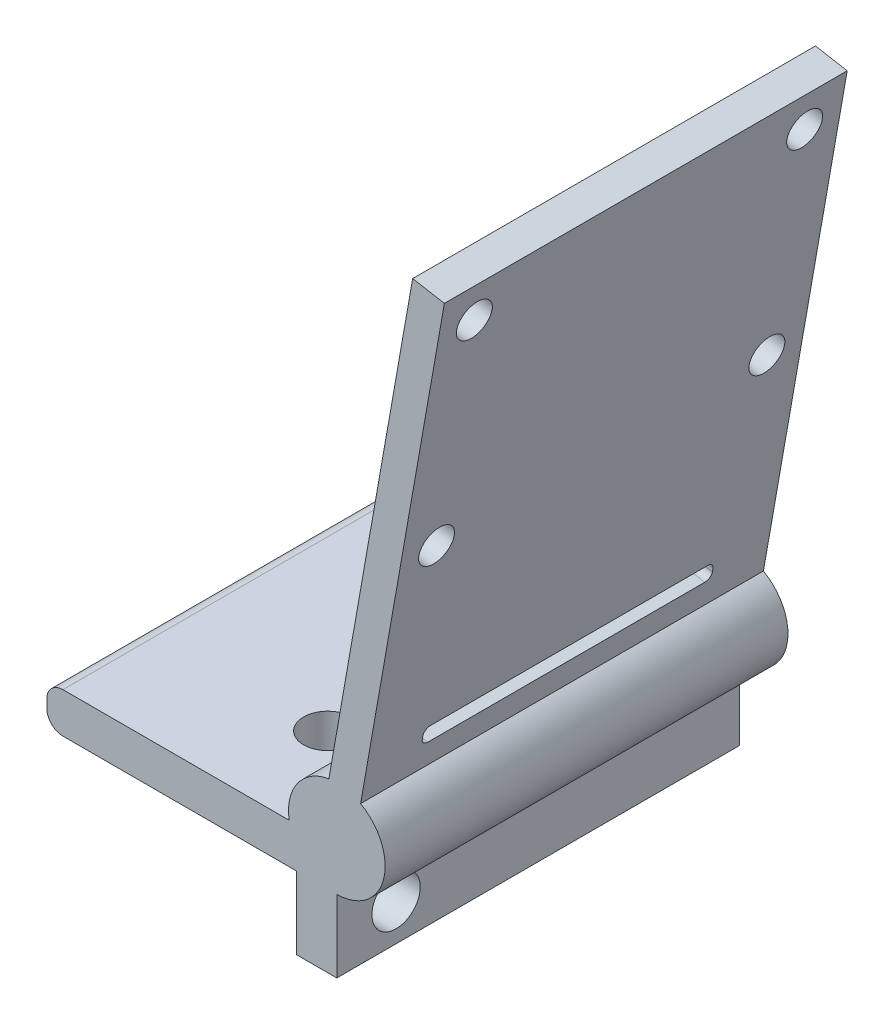
ISO-10303-21;
HEADER;
FILE_DESCRIPTION(('STEP AP214'),'2;1');
FILE_NAME('part.step','',(''),(''),'','','');
FILE_SCHEMA(('AUTOMOTIVE_DESIGN { 1 0 10303 214 1 1 1 1 }'));
ENDSEC;
DATA;
#1=APPLICATION_CONTEXT('core data for automotive mechanical design processes');
#2=APPLICATION_PROTOCOL_DEFINITION('international standard','automotive_design',2000,#1);
#3=PRODUCT_CONTEXT('',#1,'mechanical');
#4=PRODUCT('Part','Part','',(#3));
#5=PRODUCT_RELATED_PRODUCT_CATEGORY('part','',(#4));
#6=PRODUCT_DEFINITION_FORMATION('','',#4);
#7=PRODUCT_DEFINITION_CONTEXT('part definition',#1,'design');
#8=PRODUCT_DEFINITION('design','',#6,#7);
#9=PRODUCT_DEFINITION_SHAPE('','',#8);
#10=(LENGTH_UNIT() NAMED_UNIT(*) SI_UNIT(.MILLI.,.METRE.));
#11=(NAMED_UNIT(*) PLANE_ANGLE_UNIT() SI_UNIT($,.RADIAN.));
#12=(NAMED_UNIT(*) SI_UNIT($,.STERADIAN.) SOLID_ANGLE_UNIT());
#13=UNCERTAINTY_MEASURE_WITH_UNIT(LENGTH_MEASURE(1.E-05),#10,'distance_accuracy_value','');
#14=(GEOMETRIC_REPRESENTATION_CONTEXT(3) GLOBAL_UNCERTAINTY_ASSIGNED_CONTEXT((#13)) GLOBAL_UNIT_ASSIGNED_CONTEXT((#10,
#11,#12)) REPRESENTATION_CONTEXT('',''));
#15=CARTESIAN_POINT('',(0.,0.,0.));
#16=DIRECTION('',(0.,0.,1.));
#17=DIRECTION('',(1.,0.,0.));
#18=AXIS2_PLACEMENT_3D('',#15,#16,#17);
#19=CARTESIAN_POINT('',(-0.984807753012212,0.173648177666927,12.5));
#20=DIRECTION('',(0.984807753012209,-0.173648177666926,0.));
#21=DIRECTION('',(0.173648177666926,0.984807753012209,0.));
#22=AXIS2_PLACEMENT_3D('',#19,#20,#21);
#23=PLANE('',#22);
#24=CARTESIAN_POINT('',(4.31493462938239,30.2299807995996,-10.25));
#25=DIRECTION('',(0.984807753012209,-0.173648177666926,0.));
#26=DIRECTION('',(0.173648177666926,0.984807753012209,0.));
#27=AXIS2_PLACEMENT_3D('',#24,#25,#26);
#28=CIRCLE('',#27,1.1);
#29=CARTESIAN_POINT('',(4.50594762481601,31.313269327913,-10.25));
#30=VERTEX_POINT('',#29);
#31=EDGE_CURVE('E353',#30,#30,#28,.T.);
#32=ORIENTED_EDGE('',*,*,#31,.T.);
#33=EDGE_LOOP('',(#32));
#34=FACE_BOUND('',#33,.T.);
#35=CARTESIAN_POINT('',(1.97068423087889,16.9350761339348,-10.25));
#36=DIRECTION('',(0.984807753012209,-0.173648177666926,0.));
#37=DIRECTION('',(0.173648177666926,0.984807753012209,0.));
#38=AXIS2_PLACEMENT_3D('',#35,#36,#37);
#39=CIRCLE('',#38,1.1);
#40=CARTESIAN_POINT('',(2.16169722631251,18.0183646622482,-10.25));
#41=VERTEX_POINT('',#40);
#42=EDGE_CURVE('E359',#41,#41,#39,.T.);
#43=ORIENTED_EDGE('',*,*,#42,.T.);
#44=EDGE_LOOP('',(#43));
#45=FACE_BOUND('',#44,.T.);
#46=CARTESIAN_POINT('',(1.97068423087889,16.9350761339348,10.25));
#47=DIRECTION('',(0.984807753012209,-0.173648177666926,0.));
#48=DIRECTION('',(0.173648177666926,0.984807753012209,0.));
#49=AXIS2_PLACEMENT_3D('',#46,#47,#48);
#50=CIRCLE('',#49,1.1);
#51=CARTESIAN_POINT('',(2.16169722631251,18.0183646622482,10.25));
#52=VERTEX_POINT('',#51);
#53=EDGE_CURVE('E347',#52,#52,#50,.T.);
#54=ORIENTED_EDGE('',*,*,#53,.T.);
#55=EDGE_LOOP('',(#54));
#56=FACE_BOUND('',#55,.T.);
#57=CARTESIAN_POINT('',(4.31493462938239,30.2299807995996,10.25));
#58=DIRECTION('',(0.984807753012209,-0.173648177666926,0.));
#59=DIRECTION('',(0.173648177666926,0.984807753012209,0.));
#60=AXIS2_PLACEMENT_3D('',#57,#58,#59);
#61=CIRCLE('',#60,1.1);
#62=CARTESIAN_POINT('',(4.50594762481601,31.313269327913,10.25));
#63=VERTEX_POINT('',#62);
#64=EDGE_CURVE('E341',#63,#63,#61,.T.);
#65=ORIENTED_EDGE('',*,*,#64,.T.);
#66=EDGE_LOOP('',(#65));
#67=FACE_BOUND('',#66,.T.);
#68=DIRECTION('',(0.,0.,1.));
#69=VECTOR('',#68,1.);
#70=CARTESIAN_POINT('',(-0.0595360929690105,5.42112452147752,8.6));
#71=LINE('',#70,#69);
#72=CARTESIAN_POINT('',(-0.0595360929690105,5.42112452147752,-8.59999999999999));
#73=VERTEX_POINT('',#72);
#74=CARTESIAN_POINT('',(-0.0595360929690105,5.42112452147752,8.6));
#75=VERTEX_POINT('',#74);
#76=EDGE_CURVE('E254',#73,#75,#71,.T.);
#77=ORIENTED_EDGE('',*,*,#76,.T.);
#78=CARTESIAN_POINT('',(-0.128995364035781,5.02720142027264,8.6));
#79=DIRECTION('',(0.984807753012209,-0.173648177666926,0.));
#80=DIRECTION('',(0.173648177666926,0.984807753012209,0.));
#81=AXIS2_PLACEMENT_3D('',#78,#79,#80);
#82=CIRCLE('',#81,0.4);
#83=CARTESIAN_POINT('',(-0.128995364035782,5.02720142027264,9.));
#84=VERTEX_POINT('',#83);
#85=EDGE_CURVE('E268',#75,#84,#82,.T.);
#86=ORIENTED_EDGE('',*,*,#85,.T.);
#87=DIRECTION('',(-0.173648177666926,-0.984807753012209,0.));
#88=VECTOR('',#87,1.);
#89=CARTESIAN_POINT('',(-0.163724999569166,4.8302398696702,9.));
#90=LINE('',#89,#88);
#91=CARTESIAN_POINT('',(-0.163724999569166,4.83023986967024,9.));
#92=VERTEX_POINT('',#91);
#93=EDGE_CURVE('E305',#84,#92,#90,.T.);
#94=ORIENTED_EDGE('',*,*,#93,.T.);
#95=CARTESIAN_POINT('',(-0.163724999569166,4.8302398696702,8.6));
#96=DIRECTION('',(0.984807753012209,-0.173648177666926,0.));
#97=DIRECTION('',(-0.173648177666926,-0.984807753012209,0.));
#98=AXIS2_PLACEMENT_3D('',#95,#96,#97);
#99=CIRCLE('',#98,0.4);
#100=CARTESIAN_POINT('',(-0.233184270635937,4.43631676846532,8.6));
#101=VERTEX_POINT('',#100);
#102=EDGE_CURVE('E57',#92,#101,#99,.T.);
#103=ORIENTED_EDGE('',*,*,#102,.T.);
#104=DIRECTION('',(0.,0.,-1.));
#105=VECTOR('',#104,1.);
#106=CARTESIAN_POINT('',(-0.233184270635937,4.43631676846532,8.6));
#107=LINE('',#106,#105);
#108=CARTESIAN_POINT('',(-0.233184270635937,4.43631676846532,-8.6));
#109=VERTEX_POINT('',#108);
#110=EDGE_CURVE('E301',#101,#109,#107,.T.);
#111=ORIENTED_EDGE('',*,*,#110,.T.);
#112=CARTESIAN_POINT('',(-0.163724999569166,4.8302398696702,-8.6));
#113=DIRECTION('',(0.984807753012209,-0.173648177666926,0.));
#114=DIRECTION('',(-0.173648177666926,-0.984807753012209,0.));
#115=AXIS2_PLACEMENT_3D('',#112,#113,#114);
#116=CIRCLE('',#115,0.4);
#117=CARTESIAN_POINT('',(-0.163724999569166,4.8302398696702,-9.));
#118=VERTEX_POINT('',#117);
#119=EDGE_CURVE('E298',#109,#118,#116,.T.);
#120=ORIENTED_EDGE('',*,*,#119,.T.);
#121=DIRECTION('',(0.173648177666926,0.984807753012209,0.));
#122=VECTOR('',#121,1.);
#123=CARTESIAN_POINT('',(-0.163724999569166,4.8302398696702,-9.));
#124=LINE('',#123,#122);
#125=CARTESIAN_POINT('',(-0.128995364035781,5.02720142027264,-9.));
#126=VERTEX_POINT('',#125);
#127=EDGE_CURVE('E295',#118,#126,#124,.T.);
#128=ORIENTED_EDGE('',*,*,#127,.T.);
#129=CARTESIAN_POINT('',(-0.128995364035781,5.02720142027264,-8.6));
#130=DIRECTION('',(0.984807753012209,-0.173648177666926,0.));
#131=DIRECTION('',(-0.173648177666926,-0.984807753012209,0.));
#132=AXIS2_PLACEMENT_3D('',#129,#130,#131);
#133=CIRCLE('',#132,0.4);
#134=EDGE_CURVE('E292',#126,#73,#133,.T.);
#135=ORIENTED_EDGE('',*,*,#134,.T.);
#136=EDGE_LOOP('',(#77,#86,#94,#103,#111,#120,#128,#135));
#137=FACE_BOUND('',#136,.T.);
#138=DIRECTION('',(-0.173648177666926,-0.984807753012209,0.));
#139=VECTOR('',#138,1.);
#140=CARTESIAN_POINT('',(-0.984807753012212,0.173648177666927,-12.5));
#141=LINE('',#140,#139);
#142=CARTESIAN_POINT('',(4.70564302913297,32.445798243877,-12.5));
#143=VERTEX_POINT('',#142);
#144=CARTESIAN_POINT('',(-0.493656537136332,2.959105138947,-12.5));
#145=VERTEX_POINT('',#144);
#146=EDGE_CURVE('E214',#143,#145,#141,.T.);
#147=ORIENTED_EDGE('',*,*,#146,.T.);
#148=DIRECTION('',(0.,0.,-1.));
#149=VECTOR('',#148,1.);
#150=CARTESIAN_POINT('',(-0.493656537136332,2.959105138947,12.5));
#151=LINE('',#150,#149);
#152=CARTESIAN_POINT('',(-0.493656537136332,2.959105138947,12.5));
#153=VERTEX_POINT('',#152);
#154=EDGE_CURVE('E11',#153,#145,#151,.T.);
#155=ORIENTED_EDGE('',*,*,#154,.F.);
#156=DIRECTION('',(-0.173648177666926,-0.984807753012209,0.));
#157=VECTOR('',#156,1.);
#158=CARTESIAN_POINT('',(-0.984807753012212,0.173648177666927,12.5));
#159=LINE('',#158,#157);
#160=CARTESIAN_POINT('',(4.70564302913297,32.445798243877,12.5));
#161=VERTEX_POINT('',#160);
#162=EDGE_CURVE('E247',#161,#153,#159,.T.);
#163=ORIENTED_EDGE('',*,*,#162,.F.);
#164=DIRECTION('',(0.,0.,-1.));
#165=VECTOR('',#164,1.);
#166=CARTESIAN_POINT('',(4.70564302913297,32.445798243877,12.5));
#167=LINE('',#166,#165);
#168=EDGE_CURVE('E229',#161,#143,#167,.T.);
#169=ORIENTED_EDGE('',*,*,#168,.T.);
#170=EDGE_LOOP('',(#147,#155,#163,#169));
#171=FACE_BOUND('',#170,.T.);
#172=ADVANCED_FACE('F35',(#34,#45,#56,#67,#137,#171),#23,.F.);
#173=CARTESIAN_POINT('',(0.,0.,12.5));
#174=DIRECTION('',(0.,0.,-1.));
#175=DIRECTION('',(-1.,0.,0.));
#176=AXIS2_PLACEMENT_3D('',#173,#174,#175);
#177=CYLINDRICAL_SURFACE('',#176,3.);
#178=CARTESIAN_POINT('',(0.,0.,-12.5));
#179=DIRECTION('',(0.,0.,1.));
#180=DIRECTION('',(1.,0.,0.));
#181=AXIS2_PLACEMENT_3D('',#178,#179,#180);
#182=CIRCLE('',#181,3.);
#183=CARTESIAN_POINT('',(-2.95803989154981,-0.500000000000001,-12.5));
#184=VERTEX_POINT('',#183);
#185=EDGE_CURVE('E206',#145,#184,#182,.T.);
#186=ORIENTED_EDGE('',*,*,#185,.T.);
#187=DIRECTION('',(0.,0.,-1.));
#188=VECTOR('',#187,1.);
#189=CARTESIAN_POINT('',(-2.95803989154981,-0.500000000000001,12.5));
#190=LINE('',#189,#188);
#191=CARTESIAN_POINT('',(-2.95803989154981,-0.500000000000001,12.5));
#192=VERTEX_POINT('',#191);
#193=EDGE_CURVE('E42',#192,#184,#190,.T.);
#194=ORIENTED_EDGE('',*,*,#193,.F.);
#195=CARTESIAN_POINT('',(0.,0.,12.5));
#196=DIRECTION('',(0.,0.,1.));
#197=DIRECTION('',(1.,0.,0.));
#198=AXIS2_PLACEMENT_3D('',#195,#196,#197);
#199=CIRCLE('',#198,3.);
#200=EDGE_CURVE('E245',#153,#192,#199,.T.);
#201=ORIENTED_EDGE('',*,*,#200,.F.);
#202=ORIENTED_EDGE('',*,*,#154,.T.);
#203=EDGE_LOOP('',(#186,#194,#201,#202));
#204=FACE_BOUND('',#203,.T.);
#205=ADVANCED_FACE('F446',(#204),#177,.T.);
#206=CARTESIAN_POINT('',(0.,-0.5,12.5));
#207=DIRECTION('',(0.,-1.,0.));
#208=DIRECTION('',(1.,0.,0.));
#209=AXIS2_PLACEMENT_3D('',#206,#207,#208);
#210=PLANE('',#209);
#211=CARTESIAN_POINT('',(-6.56266980409438,-0.500000000000002,6.5));
#212=DIRECTION('',(0.,-1.,0.));
#213=DIRECTION('',(1.,0.,0.));
#214=AXIS2_PLACEMENT_3D('',#211,#212,#213);
#215=CIRCLE('',#214,1.5);
#216=CARTESIAN_POINT('',(-5.06266980409438,-0.500000000000001,6.5));
#217=VERTEX_POINT('',#216);
#218=EDGE_CURVE('E289',#217,#217,#215,.T.);
#219=ORIENTED_EDGE('',*,*,#218,.T.);
#220=EDGE_LOOP('',(#219));
#221=FACE_BOUND('',#220,.T.);
#222=CARTESIAN_POINT('',(-6.56266980409437,-0.500000000000002,-6.5));
#223=DIRECTION('',(0.,-1.,0.));
#224=DIRECTION('',(1.,0.,0.));
#225=AXIS2_PLACEMENT_3D('',#222,#223,#224);
#226=CIRCLE('',#225,1.5);
#227=CARTESIAN_POINT('',(-5.06266980409437,-0.500000000000001,-6.5));
#228=VERTEX_POINT('',#227);
#229=EDGE_CURVE('E313',#228,#228,#226,.T.);
#230=ORIENTED_EDGE('',*,*,#229,.T.);
#231=EDGE_LOOP('',(#230));
#232=FACE_BOUND('',#231,.T.);
#233=DIRECTION('',(-1.,0.,0.));
#234=VECTOR('',#233,1.);
#235=CARTESIAN_POINT('',(0.,-0.5,-12.5));
#236=LINE('',#235,#234);
#237=CARTESIAN_POINT('',(-17.,-0.500000000000003,-12.5));
#238=VERTEX_POINT('',#237);
#239=EDGE_CURVE('E213',#184,#238,#236,.T.);
#240=ORIENTED_EDGE('',*,*,#239,.T.);
#241=DIRECTION('',(0.,0.,-1.));
#242=VECTOR('',#241,1.);
#243=CARTESIAN_POINT('',(-17.,-0.500000000000003,12.5));
#244=LINE('',#243,#242);
#245=CARTESIAN_POINT('',(-17.,-0.500000000000003,12.5));
#246=VERTEX_POINT('',#245);
#247=EDGE_CURVE('E403',#246,#238,#244,.T.);
#248=ORIENTED_EDGE('',*,*,#247,.F.);
#249=DIRECTION('',(-1.,0.,0.));
#250=VECTOR('',#249,1.);
#251=CARTESIAN_POINT('',(0.,-0.5,12.5));
#252=LINE('',#251,#250);
#253=EDGE_CURVE('E243',#192,#246,#252,.T.);
#254=ORIENTED_EDGE('',*,*,#253,.F.);
#255=ORIENTED_EDGE('',*,*,#193,.T.);
#256=EDGE_LOOP('',(#240,#248,#254,#255));
#257=FACE_BOUND('',#256,.T.);
#258=ADVANCED_FACE('F408',(#221,#232,#257),#210,.F.);
#259=CARTESIAN_POINT('',(-17.,-1.5,12.5));
#260=DIRECTION('',(0.,0.,-1.));
#261=DIRECTION('',(-1.,0.,0.));
#262=AXIS2_PLACEMENT_3D('',#259,#260,#261);
#263=CYLINDRICAL_SURFACE('',#262,1.);
#264=CARTESIAN_POINT('',(-17.,-1.5,-12.5));
#265=DIRECTION('',(0.,0.,1.));
#266=DIRECTION('',(1.,0.,0.));
#267=AXIS2_PLACEMENT_3D('',#264,#265,#266);
#268=CIRCLE('',#267,1.);
#269=CARTESIAN_POINT('',(-18.,-1.50000000000001,-12.5));
#270=VERTEX_POINT('',#269);
#271=EDGE_CURVE('E218',#238,#270,#268,.T.);
#272=ORIENTED_EDGE('',*,*,#271,.T.);
#273=DIRECTION('',(0.,0.,-1.));
#274=VECTOR('',#273,1.);
#275=CARTESIAN_POINT('',(-18.,-1.50000000000001,12.5));
#276=LINE('',#275,#274);
#277=CARTESIAN_POINT('',(-18.,-1.50000000000001,12.5));
#278=VERTEX_POINT('',#277);
#279=EDGE_CURVE('E401',#278,#270,#276,.T.);
#280=ORIENTED_EDGE('',*,*,#279,.F.);
#281=CARTESIAN_POINT('',(-17.,-1.5,12.5));
#282=DIRECTION('',(0.,0.,1.));
#283=DIRECTION('',(1.,0.,0.));
#284=AXIS2_PLACEMENT_3D('',#281,#282,#283);
#285=CIRCLE('',#284,1.);
#286=EDGE_CURVE('E241',#246,#278,#285,.T.);
#287=ORIENTED_EDGE('',*,*,#286,.F.);
#288=ORIENTED_EDGE('',*,*,#247,.T.);
#289=EDGE_LOOP('',(#272,#280,#287,#288));
#290=FACE_BOUND('',#289,.T.);
#291=ADVANCED_FACE('F445',(#290),#263,.T.);
#292=CARTESIAN_POINT('',(-18.,0.,12.5));
#293=DIRECTION('',(-1.,0.,0.));
#294=DIRECTION('',(0.,0.,1.));
#295=AXIS2_PLACEMENT_3D('',#292,#293,#294);
#296=PLANE('',#295);
#297=DIRECTION('',(0.,1.,0.));
#298=VECTOR('',#297,1.);
#299=CARTESIAN_POINT('',(-18.,0.,-12.5));
#300=LINE('',#299,#298);
#301=CARTESIAN_POINT('',(-18.,-2.,-12.5));
#302=VERTEX_POINT('',#301);
#303=EDGE_CURVE('E415',#302,#270,#300,.T.);
#304=ORIENTED_EDGE('',*,*,#303,.F.);
#305=DIRECTION('',(0.,0.,-1.));
#306=VECTOR('',#305,1.);
#307=CARTESIAN_POINT('',(-18.,-2.,12.5));
#308=LINE('',#307,#306);
#309=CARTESIAN_POINT('',(-18.,-2.,12.5));
#310=VERTEX_POINT('',#309);
#311=EDGE_CURVE('E399',#310,#302,#308,.T.);
#312=ORIENTED_EDGE('',*,*,#311,.F.);
#313=DIRECTION('',(0.,1.,0.));
#314=VECTOR('',#313,1.);
#315=CARTESIAN_POINT('',(-18.,0.,12.5));
#316=LINE('',#315,#314);
#317=EDGE_CURVE('E238',#310,#278,#316,.T.);
#318=ORIENTED_EDGE('',*,*,#317,.T.);
#319=ORIENTED_EDGE('',*,*,#279,.T.);
#320=EDGE_LOOP('',(#304,#312,#318,#319));
#321=FACE_BOUND('',#320,.T.);
#322=ADVANCED_FACE('F441',(#321),#296,.T.);
#323=CARTESIAN_POINT('',(-17.,-2.,12.5));
#324=DIRECTION('',(0.,0.,-1.));
#325=DIRECTION('',(-1.,0.,0.));
#326=AXIS2_PLACEMENT_3D('',#323,#324,#325);
#327=CYLINDRICAL_SURFACE('',#326,1.);
#328=CARTESIAN_POINT('',(-17.,-2.,-12.5));
#329=DIRECTION('',(0.,0.,1.));
#330=DIRECTION('',(1.,0.,0.));
#331=AXIS2_PLACEMENT_3D('',#328,#329,#330);
#332=CIRCLE('',#331,1.);
#333=CARTESIAN_POINT('',(-17.,-3.,-12.5));
#334=VERTEX_POINT('',#333);
#335=EDGE_CURVE('E209',#302,#334,#332,.T.);
#336=ORIENTED_EDGE('',*,*,#335,.T.);
#337=DIRECTION('',(0.,0.,-1.));
#338=VECTOR('',#337,1.);
#339=CARTESIAN_POINT('',(-17.,-3.,12.5));
#340=LINE('',#339,#338);
#341=CARTESIAN_POINT('',(-17.,-3.,12.5));
#342=VERTEX_POINT('',#341);
#343=EDGE_CURVE('E196',#342,#334,#340,.T.);
#344=ORIENTED_EDGE('',*,*,#343,.F.);
#345=CARTESIAN_POINT('',(-17.,-2.,12.5));
#346=DIRECTION('',(0.,0.,1.));
#347=DIRECTION('',(1.,0.,0.));
#348=AXIS2_PLACEMENT_3D('',#345,#346,#347);
#349=CIRCLE('',#348,1.);
#350=EDGE_CURVE('E235',#310,#342,#349,.T.);
#351=ORIENTED_EDGE('',*,*,#350,.F.);
#352=ORIENTED_EDGE('',*,*,#311,.T.);
#353=EDGE_LOOP('',(#336,#344,#351,#352));
#354=FACE_BOUND('',#353,.T.);
#355=ADVANCED_FACE('F460',(#354),#327,.T.);
#356=CARTESIAN_POINT('',(0.,-3.,12.5));
#357=DIRECTION('',(0.,-1.,0.));
#358=DIRECTION('',(1.,0.,0.));
#359=AXIS2_PLACEMENT_3D('',#356,#357,#358);
#360=PLANE('',#359);
#361=DIRECTION('',(0.,0.,1.));
#362=VECTOR('',#361,1.);
#363=CARTESIAN_POINT('',(-2.5,-3.,-12.5));
#364=LINE('',#363,#362);
#365=CARTESIAN_POINT('',(-2.5,-3.,-12.5));
#366=VERTEX_POINT('',#365);
#367=CARTESIAN_POINT('',(-2.5,-3.,12.5));
#368=VERTEX_POINT('',#367);
#369=EDGE_CURVE('E321',#366,#368,#364,.T.);
#370=ORIENTED_EDGE('',*,*,#369,.T.);
#371=DIRECTION('',(-1.,0.,0.));
#372=VECTOR('',#371,1.);
#373=CARTESIAN_POINT('',(0.,-3.,12.5));
#374=LINE('',#373,#372);
#375=EDGE_CURVE('E233',#368,#342,#374,.T.);
#376=ORIENTED_EDGE('',*,*,#375,.T.);
#377=ORIENTED_EDGE('',*,*,#343,.T.);
#378=DIRECTION('',(-1.,0.,0.));
#379=VECTOR('',#378,1.);
#380=CARTESIAN_POINT('',(0.,-3.,-12.5));
#381=LINE('',#380,#379);
#382=EDGE_CURVE('E204',#366,#334,#381,.T.);
#383=ORIENTED_EDGE('',*,*,#382,.F.);
#384=EDGE_LOOP('',(#370,#376,#377,#383));
#385=FACE_BOUND('',#384,.T.);
#386=CARTESIAN_POINT('',(-6.56266980409438,-3.,6.5));
#387=DIRECTION('',(0.,-1.,0.));
#388=DIRECTION('',(1.,0.,0.));
#389=AXIS2_PLACEMENT_3D('',#386,#387,#388);
#390=CIRCLE('',#389,1.5);
#391=CARTESIAN_POINT('',(-5.06266980409438,-3.,6.5));
#392=VERTEX_POINT('',#391);
#393=EDGE_CURVE('E316',#392,#392,#390,.T.);
#394=ORIENTED_EDGE('',*,*,#393,.F.);
#395=EDGE_LOOP('',(#394));
#396=FACE_BOUND('',#395,.T.);
#397=CARTESIAN_POINT('',(-6.56266980409437,-3.,-6.5));
#398=DIRECTION('',(0.,-1.,0.));
#399=DIRECTION('',(1.,0.,0.));
#400=AXIS2_PLACEMENT_3D('',#397,#398,#399);
#401=CIRCLE('',#400,1.5);
#402=CARTESIAN_POINT('',(-5.06266980409437,-3.,-6.5));
#403=VERTEX_POINT('',#402);
#404=EDGE_CURVE('E310',#403,#403,#401,.T.);
#405=ORIENTED_EDGE('',*,*,#404,.F.);
#406=EDGE_LOOP('',(#405));
#407=FACE_BOUND('',#406,.T.);
#408=ADVANCED_FACE('F436',(#385,#396,#407),#360,.T.);
#409=CARTESIAN_POINT('',(0.,-3.,-12.5));
#410=VERTEX_POINT('',#409);
#411=CARTESIAN_POINT('',(1.47595896888809,2.61180878361315,-12.5));
#412=VERTEX_POINT('',#411);
#413=EDGE_CURVE('E193',#410,#412,#182,.T.);
#414=ORIENTED_EDGE('',*,*,#413,.T.);
#415=DIRECTION('',(0.,0.,-1.));
#416=VECTOR('',#415,1.);
#417=CARTESIAN_POINT('',(1.47595896888809,2.61180878361315,12.5));
#418=LINE('',#417,#416);
#419=CARTESIAN_POINT('',(1.47595896888809,2.61180878361315,12.5));
#420=VERTEX_POINT('',#419);
#421=EDGE_CURVE('E197',#420,#412,#418,.T.);
#422=ORIENTED_EDGE('',*,*,#421,.F.);
#423=CARTESIAN_POINT('',(0.,-3.,12.5));
#424=VERTEX_POINT('',#423);
#425=EDGE_CURVE('E195',#424,#420,#199,.T.);
#426=ORIENTED_EDGE('',*,*,#425,.F.);
#427=DIRECTION('',(0.,0.,-1.));
#428=VECTOR('',#427,1.);
#429=CARTESIAN_POINT('',(0.,-3.,12.5));
#430=LINE('',#429,#428);
#431=EDGE_CURVE('E181',#424,#410,#430,.T.);
#432=ORIENTED_EDGE('',*,*,#431,.T.);
#433=EDGE_LOOP('',(#414,#422,#426,#432));
#434=FACE_BOUND('',#433,.T.);
#435=ADVANCED_FACE('F191',(#434),#177,.T.);
#436=CARTESIAN_POINT('',(0.984807753012212,-0.173648177666927,12.5));
#437=DIRECTION('',(0.984807753012209,-0.173648177666926,0.));
#438=DIRECTION('',(0.173648177666926,0.984807753012209,0.));
#439=AXIS2_PLACEMENT_3D('',#436,#437,#438);
#440=PLANE('',#439);
#441=CARTESIAN_POINT('',(6.28455013540681,29.8826844442658,-10.25));
#442=DIRECTION('',(0.984807753012209,-0.173648177666926,0.));
#443=DIRECTION('',(0.173648177666926,0.984807753012209,0.));
#444=AXIS2_PLACEMENT_3D('',#441,#442,#443);
#445=CIRCLE('',#444,1.1);
#446=CARTESIAN_POINT('',(6.47556313084043,30.9659729725792,-10.25));
#447=VERTEX_POINT('',#446);
#448=EDGE_CURVE('E350',#447,#447,#445,.T.);
#449=ORIENTED_EDGE('',*,*,#448,.F.);
#450=EDGE_LOOP('',(#449));
#451=FACE_BOUND('',#450,.T.);
#452=CARTESIAN_POINT('',(3.94029973690331,16.5877797786009,-10.25));
#453=DIRECTION('',(0.984807753012209,-0.173648177666926,0.));
#454=DIRECTION('',(0.173648177666926,0.984807753012209,0.));
#455=AXIS2_PLACEMENT_3D('',#452,#453,#454);
#456=CIRCLE('',#455,1.1);
#457=CARTESIAN_POINT('',(4.13131273233693,17.6710683069144,-10.25));
#458=VERTEX_POINT('',#457);
#459=EDGE_CURVE('E356',#458,#458,#456,.T.);
#460=ORIENTED_EDGE('',*,*,#459,.F.);
#461=EDGE_LOOP('',(#460));
#462=FACE_BOUND('',#461,.T.);
#463=CARTESIAN_POINT('',(3.94029973690331,16.5877797786009,10.25));
#464=DIRECTION('',(0.984807753012209,-0.173648177666926,0.));
#465=DIRECTION('',(0.173648177666926,0.984807753012209,0.));
#466=AXIS2_PLACEMENT_3D('',#463,#464,#465);
#467=CIRCLE('',#466,1.1);
#468=CARTESIAN_POINT('',(4.13131273233693,17.6710683069144,10.25));
#469=VERTEX_POINT('',#468);
#470=EDGE_CURVE('E362',#469,#469,#467,.T.);
#471=ORIENTED_EDGE('',*,*,#470,.F.);
#472=EDGE_LOOP('',(#471));
#473=FACE_BOUND('',#472,.T.);
#474=CARTESIAN_POINT('',(6.28455013540681,29.8826844442658,10.25));
#475=DIRECTION('',(0.984807753012209,-0.173648177666926,0.));
#476=DIRECTION('',(0.173648177666926,0.984807753012209,0.));
#477=AXIS2_PLACEMENT_3D('',#474,#475,#476);
#478=CIRCLE('',#477,1.1);
#479=CARTESIAN_POINT('',(6.47556313084043,30.9659729725792,10.25));
#480=VERTEX_POINT('',#479);
#481=EDGE_CURVE('E344',#480,#480,#478,.T.);
#482=ORIENTED_EDGE('',*,*,#481,.F.);
#483=EDGE_LOOP('',(#482));
#484=FACE_BOUND('',#483,.T.);
#485=CARTESIAN_POINT('',(1.84062014198864,4.67990506493879,8.6));
#486=DIRECTION('',(0.984807753012209,-0.173648177666926,0.));
#487=DIRECTION('',(0.173648177666926,0.984807753012209,0.));
#488=AXIS2_PLACEMENT_3D('',#485,#486,#487);
#489=CIRCLE('',#488,0.4);
#490=CARTESIAN_POINT('',(1.91007941305541,5.07382816614367,8.6));
#491=VERTEX_POINT('',#490);
#492=CARTESIAN_POINT('',(1.84062014198864,4.67990506493879,9.));
#493=VERTEX_POINT('',#492);
#494=EDGE_CURVE('E287',#491,#493,#489,.T.);
#495=ORIENTED_EDGE('',*,*,#494,.F.);
#496=DIRECTION('',(0.,0.,1.));
#497=VECTOR('',#496,1.);
#498=CARTESIAN_POINT('',(1.91007941305541,5.07382816614367,8.6));
#499=LINE('',#498,#497);
#500=CARTESIAN_POINT('',(1.91007941305541,5.07382816614367,-8.59999999999999));
#501=VERTEX_POINT('',#500);
#502=EDGE_CURVE('E265',#501,#491,#499,.T.);
#503=ORIENTED_EDGE('',*,*,#502,.F.);
#504=CARTESIAN_POINT('',(1.84062014198864,4.67990506493879,-8.6));
#505=DIRECTION('',(0.984807753012209,-0.173648177666926,0.));
#506=DIRECTION('',(-0.173648177666926,-0.984807753012209,0.));
#507=AXIS2_PLACEMENT_3D('',#504,#505,#506);
#508=CIRCLE('',#507,0.4);
#509=CARTESIAN_POINT('',(1.84062014198864,4.67990506493879,-9.));
#510=VERTEX_POINT('',#509);
#511=EDGE_CURVE('E269',#510,#501,#508,.T.);
#512=ORIENTED_EDGE('',*,*,#511,.F.);
#513=DIRECTION('',(0.173648177666926,0.984807753012209,0.));
#514=VECTOR('',#513,1.);
#515=CARTESIAN_POINT('',(1.80589050645525,4.48294351433635,-9.));
#516=LINE('',#515,#514);
#517=CARTESIAN_POINT('',(1.80589050645525,4.48294351433635,-9.));
#518=VERTEX_POINT('',#517);
#519=EDGE_CURVE('E272',#518,#510,#516,.T.);
#520=ORIENTED_EDGE('',*,*,#519,.F.);
#521=CARTESIAN_POINT('',(1.80589050645525,4.48294351433635,-8.6));
#522=DIRECTION('',(0.984807753012209,-0.173648177666926,0.));
#523=DIRECTION('',(-0.173648177666926,-0.984807753012209,0.));
#524=AXIS2_PLACEMENT_3D('',#521,#522,#523);
#525=CIRCLE('',#524,0.4);
#526=CARTESIAN_POINT('',(1.73643123538848,4.08902041313146,-8.6));
#527=VERTEX_POINT('',#526);
#528=EDGE_CURVE('E275',#527,#518,#525,.T.);
#529=ORIENTED_EDGE('',*,*,#528,.F.);
#530=DIRECTION('',(0.,0.,-1.));
#531=VECTOR('',#530,1.);
#532=CARTESIAN_POINT('',(1.73643123538848,4.08902041313146,8.6));
#533=LINE('',#532,#531);
#534=CARTESIAN_POINT('',(1.73643123538848,4.08902041313146,8.6));
#535=VERTEX_POINT('',#534);
#536=EDGE_CURVE('E278',#535,#527,#533,.T.);
#537=ORIENTED_EDGE('',*,*,#536,.F.);
#538=CARTESIAN_POINT('',(1.80589050645525,4.48294351433635,8.6));
#539=DIRECTION('',(0.984807753012209,-0.173648177666926,0.));
#540=DIRECTION('',(-0.173648177666926,-0.984807753012209,0.));
#541=AXIS2_PLACEMENT_3D('',#538,#539,#540);
#542=CIRCLE('',#541,0.4);
#543=CARTESIAN_POINT('',(1.80589050645525,4.48294351433635,9.));
#544=VERTEX_POINT('',#543);
#545=EDGE_CURVE('E281',#544,#535,#542,.T.);
#546=ORIENTED_EDGE('',*,*,#545,.F.);
#547=DIRECTION('',(-0.173648177666926,-0.984807753012209,0.));
#548=VECTOR('',#547,1.);
#549=CARTESIAN_POINT('',(1.80589050645525,4.48294351433635,9.));
#550=LINE('',#549,#548);
#551=EDGE_CURVE('E284',#493,#544,#550,.T.);
#552=ORIENTED_EDGE('',*,*,#551,.F.);
#553=EDGE_LOOP('',(#495,#503,#512,#520,#529,#537,#546,#552));
#554=FACE_BOUND('',#553,.T.);
#555=DIRECTION('',(-0.173648177666926,-0.984807753012209,0.));
#556=VECTOR('',#555,1.);
#557=CARTESIAN_POINT('',(0.984807753012212,-0.173648177666927,-12.5));
#558=LINE('',#557,#556);
#559=CARTESIAN_POINT('',(6.67525853515738,32.0985018885432,-12.5));
#560=VERTEX_POINT('',#559);
#561=EDGE_CURVE('E203',#560,#412,#558,.T.);
#562=ORIENTED_EDGE('',*,*,#561,.F.);
#563=DIRECTION('',(0.,0.,-1.));
#564=VECTOR('',#563,1.);
#565=CARTESIAN_POINT('',(6.67525853515738,32.0985018885432,12.5));
#566=LINE('',#565,#564);
#567=CARTESIAN_POINT('',(6.67525853515738,32.0985018885432,12.5));
#568=VERTEX_POINT('',#567);
#569=EDGE_CURVE('E390',#568,#560,#566,.T.);
#570=ORIENTED_EDGE('',*,*,#569,.F.);
#571=DIRECTION('',(-0.173648177666926,-0.984807753012209,0.));
#572=VECTOR('',#571,1.);
#573=CARTESIAN_POINT('',(0.984807753012212,-0.173648177666927,12.5));
#574=LINE('',#573,#572);
#575=EDGE_CURVE('E230',#568,#420,#574,.T.);
#576=ORIENTED_EDGE('',*,*,#575,.T.);
#577=ORIENTED_EDGE('',*,*,#421,.T.);
#578=EDGE_LOOP('',(#562,#570,#576,#577));
#579=FACE_BOUND('',#578,.T.);
#580=ADVANCED_FACE('F378',(#451,#462,#473,#484,#554,#579),#440,.T.);
#581=CARTESIAN_POINT('',(5.69045078214535,32.2721500662101,12.5));
#582=DIRECTION('',(-0.173648177666932,-0.984807753012208,0.));
#583=DIRECTION('',(0.984807753012208,-0.173648177666932,0.));
#584=AXIS2_PLACEMENT_3D('',#581,#582,#583);
#585=PLANE('',#584);
#586=DIRECTION('',(-0.984807753012208,0.173648177666932,0.));
#587=VECTOR('',#586,1.);
#588=CARTESIAN_POINT('',(5.69045078214535,32.2721500662101,-12.5));
#589=LINE('',#588,#587);
#590=EDGE_CURVE('E207',#560,#143,#589,.T.);
#591=ORIENTED_EDGE('',*,*,#590,.T.);
#592=ORIENTED_EDGE('',*,*,#168,.F.);
#593=DIRECTION('',(-0.984807753012208,0.173648177666932,0.));
#594=VECTOR('',#593,1.);
#595=CARTESIAN_POINT('',(5.69045078214535,32.2721500662101,12.5));
#596=LINE('',#595,#594);
#597=EDGE_CURVE('E227',#568,#161,#596,.T.);
#598=ORIENTED_EDGE('',*,*,#597,.F.);
#599=ORIENTED_EDGE('',*,*,#569,.T.);
#600=EDGE_LOOP('',(#591,#592,#598,#599));
#601=FACE_BOUND('',#600,.T.);
#602=ADVANCED_FACE('F381',(#601),#585,.F.);
#603=CARTESIAN_POINT('',(0.,0.,12.5));
#604=DIRECTION('',(0.,0.,1.));
#605=DIRECTION('',(1.,0.,0.));
#606=AXIS2_PLACEMENT_3D('',#603,#604,#605);
#607=PLANE('',#606);
#608=ORIENTED_EDGE('',*,*,#162,.T.);
#609=ORIENTED_EDGE('',*,*,#200,.T.);
#610=ORIENTED_EDGE('',*,*,#253,.T.);
#611=ORIENTED_EDGE('',*,*,#286,.T.);
#612=ORIENTED_EDGE('',*,*,#317,.F.);
#613=ORIENTED_EDGE('',*,*,#350,.T.);
#614=ORIENTED_EDGE('',*,*,#375,.F.);
#615=DIRECTION('',(0.,-1.,0.));
#616=VECTOR('',#615,1.);
#617=CARTESIAN_POINT('',(-2.5,-3.,12.5));
#618=LINE('',#617,#616);
#619=CARTESIAN_POINT('',(-2.5,-7.5,12.5));
#620=VERTEX_POINT('',#619);
#621=EDGE_CURVE('E330',#368,#620,#618,.T.);
#622=ORIENTED_EDGE('',*,*,#621,.T.);
#623=DIRECTION('',(1.,0.,0.));
#624=VECTOR('',#623,1.);
#625=CARTESIAN_POINT('',(0.,-7.5,12.5));
#626=LINE('',#625,#624);
#627=CARTESIAN_POINT('',(0.,-7.5,12.5));
#628=VERTEX_POINT('',#627);
#629=EDGE_CURVE('E186',#620,#628,#626,.T.);
#630=ORIENTED_EDGE('',*,*,#629,.T.);
#631=DIRECTION('',(0.,1.,0.));
#632=VECTOR('',#631,1.);
#633=CARTESIAN_POINT('',(0.,-3.,12.5));
#634=LINE('',#633,#632);
#635=EDGE_CURVE('E333',#628,#424,#634,.T.);
#636=ORIENTED_EDGE('',*,*,#635,.T.);
#637=ORIENTED_EDGE('',*,*,#425,.T.);
#638=ORIENTED_EDGE('',*,*,#575,.F.);
#639=ORIENTED_EDGE('',*,*,#597,.T.);
#640=EDGE_LOOP('',(#608,#609,#610,#611,#612,#613,#614,#622,#630,#636,#637,#638,#639));
#641=FACE_BOUND('',#640,.T.);
#642=ADVANCED_FACE('F427',(#641),#607,.T.);
#643=CARTESIAN_POINT('',(0.,0.,-12.5));
#644=DIRECTION('',(0.,0.,1.));
#645=DIRECTION('',(1.,0.,0.));
#646=AXIS2_PLACEMENT_3D('',#643,#644,#645);
#647=PLANE('',#646);
#648=ORIENTED_EDGE('',*,*,#146,.F.);
#649=ORIENTED_EDGE('',*,*,#590,.F.);
#650=ORIENTED_EDGE('',*,*,#561,.T.);
#651=ORIENTED_EDGE('',*,*,#413,.F.);
#652=DIRECTION('',(0.,1.,0.));
#653=VECTOR('',#652,1.);
#654=CARTESIAN_POINT('',(0.,-3.,-12.5));
#655=LINE('',#654,#653);
#656=CARTESIAN_POINT('',(0.,-7.5,-12.5));
#657=VERTEX_POINT('',#656);
#658=EDGE_CURVE('E177',#657,#410,#655,.T.);
#659=ORIENTED_EDGE('',*,*,#658,.F.);
#660=DIRECTION('',(1.,0.,0.));
#661=VECTOR('',#660,1.);
#662=CARTESIAN_POINT('',(0.,-7.5,-12.5));
#663=LINE('',#662,#661);
#664=CARTESIAN_POINT('',(-2.5,-7.5,-12.5));
#665=VERTEX_POINT('',#664);
#666=EDGE_CURVE('E325',#665,#657,#663,.T.);
#667=ORIENTED_EDGE('',*,*,#666,.F.);
#668=DIRECTION('',(0.,-1.,0.));
#669=VECTOR('',#668,1.);
#670=CARTESIAN_POINT('',(-2.5,-3.,-12.5));
#671=LINE('',#670,#669);
#672=EDGE_CURVE('E49',#366,#665,#671,.T.);
#673=ORIENTED_EDGE('',*,*,#672,.F.);
#674=ORIENTED_EDGE('',*,*,#382,.T.);
#675=ORIENTED_EDGE('',*,*,#335,.F.);
#676=ORIENTED_EDGE('',*,*,#303,.T.);
#677=ORIENTED_EDGE('',*,*,#271,.F.);
#678=ORIENTED_EDGE('',*,*,#239,.F.);
#679=ORIENTED_EDGE('',*,*,#185,.F.);
#680=EDGE_LOOP('',(#648,#649,#650,#651,#659,#667,#673,#674,#675,#676,#677,#678,#679));
#681=FACE_BOUND('',#680,.T.);
#682=ADVANCED_FACE('F200',(#681),#647,.F.);
#683=CARTESIAN_POINT('',(-0.128995364035781,5.02720142027264,8.6));
#684=DIRECTION('',(0.984807753012209,-0.173648177666926,0.));
#685=DIRECTION('',(0.173648177666926,0.984807753012209,0.));
#686=AXIS2_PLACEMENT_3D('',#683,#684,#685);
#687=CYLINDRICAL_SURFACE('',#686,0.4);
#688=ORIENTED_EDGE('',*,*,#494,.T.);
#689=DIRECTION('',(0.984807753012209,-0.173648177666926,0.));
#690=VECTOR('',#689,1.);
#691=CARTESIAN_POINT('',(-0.128995364035782,5.02720142027264,9.));
#692=LINE('',#691,#690);
#693=EDGE_CURVE('E250',#84,#493,#692,.T.);
#694=ORIENTED_EDGE('',*,*,#693,.F.);
#695=ORIENTED_EDGE('',*,*,#85,.F.);
#696=DIRECTION('',(0.984807753012209,-0.173648177666926,0.));
#697=VECTOR('',#696,1.);
#698=CARTESIAN_POINT('',(-0.0595360929690105,5.42112452147752,8.6));
#699=LINE('',#698,#697);
#700=EDGE_CURVE('E220',#75,#491,#699,.T.);
#701=ORIENTED_EDGE('',*,*,#700,.T.);
#702=EDGE_LOOP('',(#688,#694,#695,#701));
#703=FACE_BOUND('',#702,.T.);
#704=ADVANCED_FACE('F498',(#703),#687,.F.);
#705=CARTESIAN_POINT('',(-0.0595360929690105,5.42112452147752,8.6));
#706=DIRECTION('',(0.173648177666926,0.984807753012209,0.));
#707=DIRECTION('',(-0.984807753012209,0.173648177666926,0.));
#708=AXIS2_PLACEMENT_3D('',#705,#706,#707);
#709=PLANE('',#708);
#710=ORIENTED_EDGE('',*,*,#502,.T.);
#711=ORIENTED_EDGE('',*,*,#700,.F.);
#712=ORIENTED_EDGE('',*,*,#76,.F.);
#713=DIRECTION('',(0.984807753012209,-0.173648177666926,0.));
#714=VECTOR('',#713,1.);
#715=CARTESIAN_POINT('',(-0.0595360929690105,5.42112452147752,-8.59999999999999));
#716=LINE('',#715,#714);
#717=EDGE_CURVE('E224',#73,#501,#716,.T.);
#718=ORIENTED_EDGE('',*,*,#717,.T.);
#719=EDGE_LOOP('',(#710,#711,#712,#718));
#720=FACE_BOUND('',#719,.T.);
#721=ADVANCED_FACE('F503',(#720),#709,.F.);
#722=CARTESIAN_POINT('',(-0.128995364035781,5.02720142027264,-8.6));
#723=DIRECTION('',(0.984807753012209,-0.173648177666926,0.));
#724=DIRECTION('',(0.173648177666926,0.984807753012209,0.));
#725=AXIS2_PLACEMENT_3D('',#722,#723,#724);
#726=CYLINDRICAL_SURFACE('',#725,0.4);
#727=ORIENTED_EDGE('',*,*,#511,.T.);
#728=ORIENTED_EDGE('',*,*,#717,.F.);
#729=ORIENTED_EDGE('',*,*,#134,.F.);
#730=DIRECTION('',(0.984807753012209,-0.173648177666926,0.));
#731=VECTOR('',#730,1.);
#732=CARTESIAN_POINT('',(-0.128995364035781,5.02720142027264,-9.));
#733=LINE('',#732,#731);
#734=EDGE_CURVE('E262',#126,#510,#733,.T.);
#735=ORIENTED_EDGE('',*,*,#734,.T.);
#736=EDGE_LOOP('',(#727,#728,#729,#735));
#737=FACE_BOUND('',#736,.T.);
#738=ADVANCED_FACE('F515',(#737),#726,.F.);
#739=CARTESIAN_POINT('',(-0.163724999569166,4.8302398696702,-9.));
#740=DIRECTION('',(0.,0.,-1.));
#741=DIRECTION('',(-1.,0.,0.));
#742=AXIS2_PLACEMENT_3D('',#739,#740,#741);
#743=PLANE('',#742);
#744=ORIENTED_EDGE('',*,*,#519,.T.);
#745=ORIENTED_EDGE('',*,*,#734,.F.);
#746=ORIENTED_EDGE('',*,*,#127,.F.);
#747=DIRECTION('',(0.984807753012209,-0.173648177666926,0.));
#748=VECTOR('',#747,1.);
#749=CARTESIAN_POINT('',(-0.163724999569166,4.8302398696702,-9.));
#750=LINE('',#749,#748);
#751=EDGE_CURVE('E260',#118,#518,#750,.T.);
#752=ORIENTED_EDGE('',*,*,#751,.T.);
#753=EDGE_LOOP('',(#744,#745,#746,#752));
#754=FACE_BOUND('',#753,.T.);
#755=ADVANCED_FACE('F525',(#754),#743,.F.);
#756=CARTESIAN_POINT('',(-0.163724999569166,4.8302398696702,-8.6));
#757=DIRECTION('',(0.984807753012209,-0.173648177666926,0.));
#758=DIRECTION('',(0.173648177666926,0.984807753012209,0.));
#759=AXIS2_PLACEMENT_3D('',#756,#757,#758);
#760=CYLINDRICAL_SURFACE('',#759,0.4);
#761=ORIENTED_EDGE('',*,*,#528,.T.);
#762=ORIENTED_EDGE('',*,*,#751,.F.);
#763=ORIENTED_EDGE('',*,*,#119,.F.);
#764=DIRECTION('',(0.984807753012209,-0.173648177666926,0.));
#765=VECTOR('',#764,1.);
#766=CARTESIAN_POINT('',(-0.233184270635937,4.43631676846532,-8.6));
#767=LINE('',#766,#765);
#768=EDGE_CURVE('E258',#109,#527,#767,.T.);
#769=ORIENTED_EDGE('',*,*,#768,.T.);
#770=EDGE_LOOP('',(#761,#762,#763,#769));
#771=FACE_BOUND('',#770,.T.);
#772=ADVANCED_FACE('F535',(#771),#760,.F.);
#773=CARTESIAN_POINT('',(-0.233184270635937,4.43631676846532,8.6));
#774=DIRECTION('',(-0.173648177666926,-0.984807753012209,0.));
#775=DIRECTION('',(0.984807753012209,-0.173648177666926,0.));
#776=AXIS2_PLACEMENT_3D('',#773,#774,#775);
#777=PLANE('',#776);
#778=ORIENTED_EDGE('',*,*,#536,.T.);
#779=ORIENTED_EDGE('',*,*,#768,.F.);
#780=ORIENTED_EDGE('',*,*,#110,.F.);
#781=DIRECTION('',(0.984807753012209,-0.173648177666926,0.));
#782=VECTOR('',#781,1.);
#783=CARTESIAN_POINT('',(-0.233184270635937,4.43631676846532,8.6));
#784=LINE('',#783,#782);
#785=EDGE_CURVE('E256',#101,#535,#784,.T.);
#786=ORIENTED_EDGE('',*,*,#785,.T.);
#787=EDGE_LOOP('',(#778,#779,#780,#786));
#788=FACE_BOUND('',#787,.T.);
#789=ADVANCED_FACE('F545',(#788),#777,.F.);
#790=CARTESIAN_POINT('',(-0.163724999569166,4.8302398696702,8.6));
#791=DIRECTION('',(0.984807753012209,-0.173648177666926,0.));
#792=DIRECTION('',(0.173648177666926,0.984807753012209,0.));
#793=AXIS2_PLACEMENT_3D('',#790,#791,#792);
#794=CYLINDRICAL_SURFACE('',#793,0.4);
#795=ORIENTED_EDGE('',*,*,#545,.T.);
#796=ORIENTED_EDGE('',*,*,#785,.F.);
#797=ORIENTED_EDGE('',*,*,#102,.F.);
#798=DIRECTION('',(0.984807753012209,-0.173648177666926,0.));
#799=VECTOR('',#798,1.);
#800=CARTESIAN_POINT('',(-0.163724999569166,4.8302398696702,9.));
#801=LINE('',#800,#799);
#802=EDGE_CURVE('E253',#92,#544,#801,.T.);
#803=ORIENTED_EDGE('',*,*,#802,.T.);
#804=EDGE_LOOP('',(#795,#796,#797,#803));
#805=FACE_BOUND('',#804,.T.);
#806=ADVANCED_FACE('F555',(#805),#794,.F.);
#807=CARTESIAN_POINT('',(-0.163724999569166,4.8302398696702,9.));
#808=DIRECTION('',(0.,0.,1.));
#809=DIRECTION('',(1.,0.,0.));
#810=AXIS2_PLACEMENT_3D('',#807,#808,#809);
#811=PLANE('',#810);
#812=ORIENTED_EDGE('',*,*,#551,.T.);
#813=ORIENTED_EDGE('',*,*,#802,.F.);
#814=ORIENTED_EDGE('',*,*,#93,.F.);
#815=ORIENTED_EDGE('',*,*,#693,.T.);
#816=EDGE_LOOP('',(#812,#813,#814,#815));
#817=FACE_BOUND('',#816,.T.);
#818=ADVANCED_FACE('F565',(#817),#811,.F.);
#819=CARTESIAN_POINT('',(-6.56266980409437,-0.500000000000002,-6.5));
#820=DIRECTION('',(0.,-1.,0.));
#821=DIRECTION('',(1.,0.,0.));
#822=AXIS2_PLACEMENT_3D('',#819,#820,#821);
#823=CYLINDRICAL_SURFACE('',#822,1.5);
#824=ORIENTED_EDGE('',*,*,#229,.F.);
#825=EDGE_LOOP('',(#824));
#826=FACE_BOUND('',#825,.T.);
#827=ORIENTED_EDGE('',*,*,#404,.T.);
#828=EDGE_LOOP('',(#827));
#829=FACE_BOUND('',#828,.T.);
#830=ADVANCED_FACE('F573',(#826,#829),#823,.F.);
#831=CARTESIAN_POINT('',(-6.56266980409438,-0.500000000000002,6.5));
#832=DIRECTION('',(0.,-1.,0.));
#833=DIRECTION('',(1.,0.,0.));
#834=AXIS2_PLACEMENT_3D('',#831,#832,#833);
#835=CYLINDRICAL_SURFACE('',#834,1.5);
#836=ORIENTED_EDGE('',*,*,#218,.F.);
#837=EDGE_LOOP('',(#836));
#838=FACE_BOUND('',#837,.T.);
#839=ORIENTED_EDGE('',*,*,#393,.T.);
#840=EDGE_LOOP('',(#839));
#841=FACE_BOUND('',#840,.T.);
#842=ADVANCED_FACE('F589',(#838,#841),#835,.F.);
#843=CARTESIAN_POINT('',(0.,-3.,-12.5));
#844=DIRECTION('',(1.,0.,0.));
#845=DIRECTION('',(0.,1.,0.));
#846=AXIS2_PLACEMENT_3D('',#843,#844,#845);
#847=PLANE('',#846);
#848=CARTESIAN_POINT('',(0.,-5.19329488074252,8.82280639852798));
#849=DIRECTION('',(1.,0.,0.));
#850=DIRECTION('',(0.,1.,0.));
#851=AXIS2_PLACEMENT_3D('',#848,#849,#850);
#852=CIRCLE('',#851,1.50000284732743);
#853=CARTESIAN_POINT('',(0.,-3.69329203341509,8.82280639852798));
#854=VERTEX_POINT('',#853);
#855=EDGE_CURVE('E338',#854,#854,#852,.T.);
#856=ORIENTED_EDGE('',*,*,#855,.F.);
#857=EDGE_LOOP('',(#856));
#858=FACE_BOUND('',#857,.T.);
#859=ORIENTED_EDGE('',*,*,#635,.F.);
#860=DIRECTION('',(0.,0.,1.));
#861=VECTOR('',#860,1.);
#862=CARTESIAN_POINT('',(0.,-7.5,-12.5));
#863=LINE('',#862,#861);
#864=EDGE_CURVE('E183',#657,#628,#863,.T.);
#865=ORIENTED_EDGE('',*,*,#864,.F.);
#866=ORIENTED_EDGE('',*,*,#658,.T.);
#867=ORIENTED_EDGE('',*,*,#431,.F.);
#868=EDGE_LOOP('',(#859,#865,#866,#867));
#869=FACE_BOUND('',#868,.T.);
#870=ADVANCED_FACE('F180',(#858,#869),#847,.T.);
#871=CARTESIAN_POINT('',(0.,-7.5,-12.5));
#872=DIRECTION('',(0.,-1.,0.));
#873=DIRECTION('',(0.,0.,-1.));
#874=AXIS2_PLACEMENT_3D('',#871,#872,#873);
#875=PLANE('',#874);
#876=ORIENTED_EDGE('',*,*,#629,.F.);
#877=DIRECTION('',(0.,0.,1.));
#878=VECTOR('',#877,1.);
#879=CARTESIAN_POINT('',(-2.5,-7.5,-12.5));
#880=LINE('',#879,#878);
#881=EDGE_CURVE('E324',#665,#620,#880,.T.);
#882=ORIENTED_EDGE('',*,*,#881,.F.);
#883=ORIENTED_EDGE('',*,*,#666,.T.);
#884=ORIENTED_EDGE('',*,*,#864,.T.);
#885=EDGE_LOOP('',(#876,#882,#883,#884));
#886=FACE_BOUND('',#885,.T.);
#887=ADVANCED_FACE('F431',(#886),#875,.T.);
#888=CARTESIAN_POINT('',(-2.5,-3.,-12.5));
#889=DIRECTION('',(-1.,0.,0.));
#890=DIRECTION('',(0.,-1.,0.));
#891=AXIS2_PLACEMENT_3D('',#888,#889,#890);
#892=PLANE('',#891);
#893=CARTESIAN_POINT('',(-2.5,-5.19329488074252,8.82280639852798));
#894=DIRECTION('',(1.,0.,0.));
#895=DIRECTION('',(0.,1.,0.));
#896=AXIS2_PLACEMENT_3D('',#893,#894,#895);
#897=CIRCLE('',#896,1.50000284732743);
#898=CARTESIAN_POINT('',(-2.5,-3.69329203341509,8.82280639852798));
#899=VERTEX_POINT('',#898);
#900=EDGE_CURVE('E335',#899,#899,#897,.T.);
#901=ORIENTED_EDGE('',*,*,#900,.T.);
#902=EDGE_LOOP('',(#901));
#903=FACE_BOUND('',#902,.T.);
#904=ORIENTED_EDGE('',*,*,#621,.F.);
#905=ORIENTED_EDGE('',*,*,#369,.F.);
#906=ORIENTED_EDGE('',*,*,#672,.T.);
#907=ORIENTED_EDGE('',*,*,#881,.T.);
#908=EDGE_LOOP('',(#904,#905,#906,#907));
#909=FACE_BOUND('',#908,.T.);
#910=ADVANCED_FACE('F433',(#903,#909),#892,.T.);
#911=CARTESIAN_POINT('',(-2.5,-5.19329488074252,8.82280639852798));
#912=DIRECTION('',(1.,0.,0.));
#913=DIRECTION('',(0.,1.,0.));
#914=AXIS2_PLACEMENT_3D('',#911,#912,#913);
#915=CYLINDRICAL_SURFACE('',#914,1.50000284732743);
#916=ORIENTED_EDGE('',*,*,#900,.F.);
#917=EDGE_LOOP('',(#916));
#918=FACE_BOUND('',#917,.T.);
#919=ORIENTED_EDGE('',*,*,#855,.T.);
#920=EDGE_LOOP('',(#919));
#921=FACE_BOUND('',#920,.T.);
#922=ADVANCED_FACE('F647',(#918,#921),#915,.F.);
#923=CARTESIAN_POINT('',(4.31493462938239,30.2299807995996,10.25));
#924=DIRECTION('',(0.984807753012209,-0.173648177666926,0.));
#925=DIRECTION('',(0.173648177666926,0.984807753012209,0.));
#926=AXIS2_PLACEMENT_3D('',#923,#924,#925);
#927=CYLINDRICAL_SURFACE('',#926,1.1);
#928=ORIENTED_EDGE('',*,*,#64,.F.);
#929=EDGE_LOOP('',(#928));
#930=FACE_BOUND('',#929,.T.);
#931=ORIENTED_EDGE('',*,*,#481,.T.);
#932=EDGE_LOOP('',(#931));
#933=FACE_BOUND('',#932,.T.);
#934=ADVANCED_FACE('F374',(#930,#933),#927,.F.);
#935=CARTESIAN_POINT('',(1.97068423087889,16.9350761339348,10.25));
#936=DIRECTION('',(0.984807753012209,-0.173648177666926,0.));
#937=DIRECTION('',(0.173648177666926,0.984807753012209,0.));
#938=AXIS2_PLACEMENT_3D('',#935,#936,#937);
#939=CYLINDRICAL_SURFACE('',#938,1.1);
#940=ORIENTED_EDGE('',*,*,#53,.F.);
#941=EDGE_LOOP('',(#940));
#942=FACE_BOUND('',#941,.T.);
#943=ORIENTED_EDGE('',*,*,#470,.T.);
#944=EDGE_LOOP('',(#943));
#945=FACE_BOUND('',#944,.T.);
#946=ADVANCED_FACE('F370',(#942,#945),#939,.F.);
#947=CARTESIAN_POINT('',(1.97068423087889,16.9350761339348,-10.25));
#948=DIRECTION('',(0.984807753012209,-0.173648177666926,0.));
#949=DIRECTION('',(0.173648177666926,0.984807753012209,0.));
#950=AXIS2_PLACEMENT_3D('',#947,#948,#949);
#951=CYLINDRICAL_SURFACE('',#950,1.1);
#952=ORIENTED_EDGE('',*,*,#42,.F.);
#953=EDGE_LOOP('',(#952));
#954=FACE_BOUND('',#953,.T.);
#955=ORIENTED_EDGE('',*,*,#459,.T.);
#956=EDGE_LOOP('',(#955));
#957=FACE_BOUND('',#956,.T.);
#958=ADVANCED_FACE('F373',(#954,#957),#951,.F.);
#959=CARTESIAN_POINT('',(4.31493462938239,30.2299807995996,-10.25));
#960=DIRECTION('',(0.984807753012209,-0.173648177666926,0.));
#961=DIRECTION('',(0.173648177666926,0.984807753012209,0.));
#962=AXIS2_PLACEMENT_3D('',#959,#960,#961);
#963=CYLINDRICAL_SURFACE('',#962,1.1);
#964=ORIENTED_EDGE('',*,*,#31,.F.);
#965=EDGE_LOOP('',(#964));
#966=FACE_BOUND('',#965,.T.);
#967=ORIENTED_EDGE('',*,*,#448,.T.);
#968=EDGE_LOOP('',(#967));
#969=FACE_BOUND('',#968,.T.);
#970=ADVANCED_FACE('F692',(#966,#969),#963,.F.);
#971=CLOSED_SHELL('',(#172,#205,#258,#291,#322,#355,#408,#435,#580,#602,#642,#682,#704,#721,
#738,#755,#772,#789,#806,#818,#830,#842,#870,#887,#910,#922,#934,#946,#958,#970));
#972=MANIFOLD_SOLID_BREP('B2',#971);
#973=ADVANCED_BREP_SHAPE_REPRESENTATION('',(#18,#972),#14);
#974=SHAPE_DEFINITION_REPRESENTATION(#9,#973);
ENDSEC;
END-ISO-10303-21;
